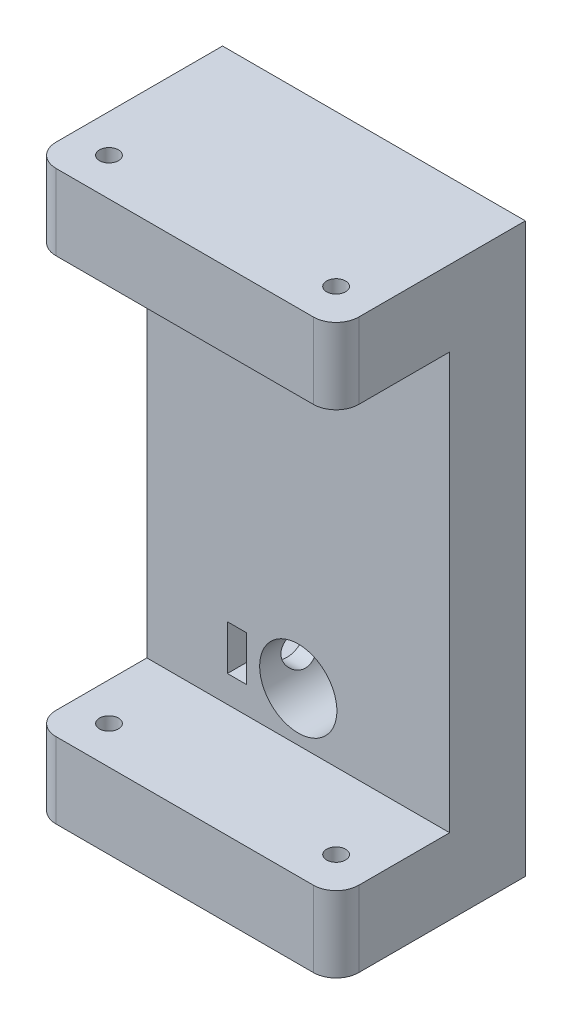
ISO-10303-21;
HEADER;
FILE_DESCRIPTION(('STEP AP214'),'2;1');
FILE_NAME('part.step','',(''),(''),'','','');
FILE_SCHEMA(('AUTOMOTIVE_DESIGN { 1 0 10303 214 1 1 1 1 }'));
ENDSEC;
DATA;
#1=APPLICATION_CONTEXT('core data for automotive mechanical design processes');
#2=APPLICATION_PROTOCOL_DEFINITION('international standard','automotive_design',2000,#1);
#3=PRODUCT_CONTEXT('',#1,'mechanical');
#4=PRODUCT('Part','Part','',(#3));
#5=PRODUCT_RELATED_PRODUCT_CATEGORY('part','',(#4));
#6=PRODUCT_DEFINITION_FORMATION('','',#4);
#7=PRODUCT_DEFINITION_CONTEXT('part definition',#1,'design');
#8=PRODUCT_DEFINITION('design','',#6,#7);
#9=PRODUCT_DEFINITION_SHAPE('','',#8);
#10=(LENGTH_UNIT() NAMED_UNIT(*) SI_UNIT(.MILLI.,.METRE.));
#11=(NAMED_UNIT(*) PLANE_ANGLE_UNIT() SI_UNIT($,.RADIAN.));
#12=(NAMED_UNIT(*) SI_UNIT($,.STERADIAN.) SOLID_ANGLE_UNIT());
#13=UNCERTAINTY_MEASURE_WITH_UNIT(LENGTH_MEASURE(1.E-05),#10,'distance_accuracy_value','');
#14=(GEOMETRIC_REPRESENTATION_CONTEXT(3) GLOBAL_UNCERTAINTY_ASSIGNED_CONTEXT((#13)) GLOBAL_UNIT_ASSIGNED_CONTEXT((#10,
#11,#12)) REPRESENTATION_CONTEXT('',''));
#15=CARTESIAN_POINT('',(0.,0.,0.));
#16=DIRECTION('',(0.,0.,1.));
#17=DIRECTION('',(1.,0.,0.));
#18=AXIS2_PLACEMENT_3D('',#15,#16,#17);
#19=CARTESIAN_POINT('',(-20.000012,-21.,4.63857049001604));
#20=DIRECTION('',(1.,0.,0.));
#21=DIRECTION('',(0.,0.,-1.));
#22=AXIS2_PLACEMENT_3D('',#19,#20,#21);
#23=CYLINDRICAL_SURFACE('',#22,2.55);
#24=CARTESIAN_POINT('',(-9.3585830921441,-21.,4.63857049001604));
#25=DIRECTION('',(-1.,0.,0.));
#26=DIRECTION('',(0.,-1.,0.));
#27=AXIS2_PLACEMENT_3D('',#24,#25,#26);
#28=CIRCLE('',#27,2.55);
#29=CARTESIAN_POINT('',(-9.3585830921441,-21.,2.08857049001604));
#30=VERTEX_POINT('',#29);
#31=EDGE_CURVE('E44',#30,#30,#28,.T.);
#32=CARTESIAN_POINT('',(-20.,-21.,4.63857049001604));
#33=DIRECTION('',(1.,0.,0.));
#34=DIRECTION('',(0.,0.,-1.));
#35=AXIS2_PLACEMENT_3D('',#32,#33,#34);
#36=CIRCLE('',#35,2.55);
#37=CARTESIAN_POINT('',(-20.,-21.,2.08857049001604));
#38=VERTEX_POINT('',#37);
#39=EDGE_CURVE('E200',#38,#38,#36,.F.);
#40=CARTESIAN_POINT('',(-9.3585830921441,-21.,2.08857049001604));
#41=CARTESIAN_POINT('',(-9.46943118493427,-21.,2.08857049001604));
#42=CARTESIAN_POINT('',(-9.58027927772443,-21.,2.08857049001604));
#43=CARTESIAN_POINT('',(-9.80197546330476,-21.,2.08857049001604));
#44=CARTESIAN_POINT('',(-9.91282355609493,-21.,2.08857049001604));
#45=CARTESIAN_POINT('',(-10.1345197416753,-21.,2.08857049001604));
#46=CARTESIAN_POINT('',(-10.2453678344654,-21.,2.08857049001604));
#47=CARTESIAN_POINT('',(-10.4670640200458,-21.,2.08857049001604));
#48=CARTESIAN_POINT('',(-10.5779121128359,-21.,2.08857049001604));
#49=CARTESIAN_POINT('',(-10.7996082984163,-21.,2.08857049001604));
#50=CARTESIAN_POINT('',(-10.9104563912064,-21.,2.08857049001604));
#51=CARTESIAN_POINT('',(-11.1321525767868,-21.,2.08857049001604));
#52=CARTESIAN_POINT('',(-11.2430006695769,-21.,2.08857049001604));
#53=CARTESIAN_POINT('',(-11.4646968551572,-21.,2.08857049001604));
#54=CARTESIAN_POINT('',(-11.5755449479474,-21.,2.08857049001604));
#55=CARTESIAN_POINT('',(-11.7972411335277,-21.,2.08857049001604));
#56=CARTESIAN_POINT('',(-11.9080892263179,-21.,2.08857049001604));
#57=CARTESIAN_POINT('',(-12.1297854118982,-21.,2.08857049001604));
#58=CARTESIAN_POINT('',(-12.2406335046884,-21.,2.08857049001604));
#59=CARTESIAN_POINT('',(-12.4623296902687,-21.,2.08857049001604));
#60=CARTESIAN_POINT('',(-12.5731777830589,-21.,2.08857049001604));
#61=CARTESIAN_POINT('',(-12.7948739686392,-21.,2.08857049001604));
#62=CARTESIAN_POINT('',(-12.9057220614294,-21.,2.08857049001604));
#63=CARTESIAN_POINT('',(-13.1274182470097,-21.,2.08857049001604));
#64=CARTESIAN_POINT('',(-13.2382663397999,-21.,2.08857049001604));
#65=CARTESIAN_POINT('',(-13.4599625253802,-21.,2.08857049001604));
#66=CARTESIAN_POINT('',(-13.5708106181704,-21.,2.08857049001604));
#67=CARTESIAN_POINT('',(-13.7925068037507,-21.,2.08857049001604));
#68=CARTESIAN_POINT('',(-13.9033548965409,-21.,2.08857049001604));
#69=CARTESIAN_POINT('',(-14.1250510821212,-21.,2.08857049001604));
#70=CARTESIAN_POINT('',(-14.2358991749114,-21.,2.08857049001604));
#71=CARTESIAN_POINT('',(-14.4575953604917,-21.,2.08857049001604));
#72=CARTESIAN_POINT('',(-14.5684434532819,-21.,2.08857049001604));
#73=CARTESIAN_POINT('',(-14.7901396388622,-21.,2.08857049001604));
#74=CARTESIAN_POINT('',(-14.9009877316524,-21.,2.08857049001604));
#75=CARTESIAN_POINT('',(-15.1226839172327,-21.,2.08857049001604));
#76=CARTESIAN_POINT('',(-15.2335320100229,-21.,2.08857049001604));
#77=CARTESIAN_POINT('',(-15.4552281956032,-21.,2.08857049001604));
#78=CARTESIAN_POINT('',(-15.5660762883934,-21.,2.08857049001604));
#79=CARTESIAN_POINT('',(-15.7877724739737,-21.,2.08857049001604));
#80=CARTESIAN_POINT('',(-15.8986205667639,-21.,2.08857049001604));
#81=CARTESIAN_POINT('',(-16.1203167523442,-21.,2.08857049001604));
#82=CARTESIAN_POINT('',(-16.2311648451344,-21.,2.08857049001604));
#83=CARTESIAN_POINT('',(-16.4528610307147,-21.,2.08857049001604));
#84=CARTESIAN_POINT('',(-16.5637091235049,-21.,2.08857049001604));
#85=CARTESIAN_POINT('',(-16.7854053090852,-21.,2.08857049001604));
#86=CARTESIAN_POINT('',(-16.8962534018754,-21.,2.08857049001604));
#87=CARTESIAN_POINT('',(-17.1179495874557,-21.,2.08857049001604));
#88=CARTESIAN_POINT('',(-17.2287976802459,-21.,2.08857049001604));
#89=CARTESIAN_POINT('',(-17.4504938658262,-21.,2.08857049001604));
#90=CARTESIAN_POINT('',(-17.5613419586164,-21.,2.08857049001604));
#91=CARTESIAN_POINT('',(-17.7830381441967,-21.,2.08857049001604));
#92=CARTESIAN_POINT('',(-17.8938862369869,-21.,2.08857049001604));
#93=CARTESIAN_POINT('',(-18.1155824225672,-21.,2.08857049001604));
#94=CARTESIAN_POINT('',(-18.2264305153574,-21.,2.08857049001604));
#95=CARTESIAN_POINT('',(-18.4481267009377,-21.,2.08857049001604));
#96=CARTESIAN_POINT('',(-18.5589747937278,-21.,2.08857049001604));
#97=CARTESIAN_POINT('',(-18.7806709793082,-21.,2.08857049001604));
#98=CARTESIAN_POINT('',(-18.8915190720983,-21.,2.08857049001604));
#99=CARTESIAN_POINT('',(-19.1132152576787,-21.,2.08857049001604));
#100=CARTESIAN_POINT('',(-19.2240633504688,-21.,2.08857049001604));
#101=CARTESIAN_POINT('',(-19.4457595360492,-21.,2.08857049001604));
#102=CARTESIAN_POINT('',(-19.5566076288393,-21.,2.08857049001604));
#103=CARTESIAN_POINT('',(-19.7783038144197,-21.,2.08857049001604));
#104=CARTESIAN_POINT('',(-19.8891519072098,-21.,2.08857049001604));
#105=CARTESIAN_POINT('',(-20.,-21.,2.08857049001604));
#106=B_SPLINE_CURVE_WITH_KNOTS('',3,(#40,#41,#42,#43,#44,#45,#46,#47,#48,#49,#50,#51,#52,#53,
#54,#55,#56,#57,#58,#59,#60,#61,#62,#63,#64,#65,#66,#67,#68,#69,#70,#71,#72,#73,#74,#75,#76,#77,
#78,#79,#80,#81,#82,#83,#84,#85,#86,#87,#88,#89,#90,#91,#92,#93,#94,#95,#96,#97,#98,#99,#100,
#101,#102,#103,#104,#105),.UNSPECIFIED.,.F.,.F.,(4,2,2,2,2,2,2,2,2,2,2,2,2,2,2,2,2,2,2,2,2,2,2,
2,2,2,2,2,2,2,2,2,4),(0.,0.332544278370497,0.665088556740995,0.99763283511149,1.33017711348199,
1.66272139185249,1.99526567022298,2.32780994859348,2.66035422696398,2.99289850533447,
3.32544278370497,3.65798706207547,3.99053134044596,4.32307561881646,4.65561989718696,
4.98816417555745,5.32070845392795,5.65325273229845,5.98579701066894,6.31834128903944,
6.65088556740994,6.98342984578044,7.31597412415093,7.64851840252143,7.98106268089193,
8.31360695926243,8.64615123763292,8.97869551600342,9.31123979437391,9.64378407274441,
9.97632835111491,10.3088726294854,10.6414169078559),.UNSPECIFIED.);
#107=EDGE_CURVE('BSEAM40',#30,#38,#106,.T.);
#108=ORIENTED_EDGE('',*,*,#31,.F.);
#109=ORIENTED_EDGE('',*,*,#39,.T.);
#110=ORIENTED_EDGE('',*,*,#107,.T.);
#111=ORIENTED_EDGE('',*,*,#107,.F.);
#112=EDGE_LOOP('',(#108,#110,#109,#111));
#113=FACE_BOUND('',#112,.T.);
#114=ADVANCED_FACE('F40',(#113),#23,.F.);
#115=CARTESIAN_POINT('',(0.,-21.,10.));
#116=DIRECTION('',(0.,0.,-1.));
#117=DIRECTION('',(-1.,0.,0.));
#118=AXIS2_PLACEMENT_3D('',#115,#116,#117);
#119=CYLINDRICAL_SURFACE('',#118,5.1);
#120=CARTESIAN_POINT('',(0.,-21.,10.));
#121=DIRECTION('',(0.,0.,-1.));
#122=DIRECTION('',(-1.,0.,0.));
#123=AXIS2_PLACEMENT_3D('',#120,#121,#122);
#124=CIRCLE('',#123,5.1);
#125=CARTESIAN_POINT('',(-5.1,-21.,10.));
#126=VERTEX_POINT('',#125);
#127=EDGE_CURVE('E417',#126,#126,#124,.T.);
#128=ORIENTED_EDGE('',*,*,#127,.F.);
#129=EDGE_LOOP('',(#128));
#130=FACE_BOUND('',#129,.T.);
#131=CARTESIAN_POINT('',(0.,-21.,0.));
#132=DIRECTION('',(0.,0.,-1.));
#133=DIRECTION('',(-1.,0.,0.));
#134=AXIS2_PLACEMENT_3D('',#131,#132,#133);
#135=CIRCLE('',#134,5.1);
#136=CARTESIAN_POINT('',(-5.1,-21.,0.));
#137=VERTEX_POINT('',#136);
#138=EDGE_CURVE('E425',#137,#137,#135,.T.);
#139=ORIENTED_EDGE('',*,*,#138,.T.);
#140=EDGE_LOOP('',(#139));
#141=FACE_BOUND('',#140,.T.);
#142=CARTESIAN_POINT('',(-5.1,-21.,7.18857049001604));
#143=CARTESIAN_POINT('',(-5.09999161101481,-21.134055215981,7.18856062757891));
#144=CARTESIAN_POINT('',(-5.09465723117983,-21.268275947126,7.17793641700653));
#145=CARTESIAN_POINT('',(-5.0738412693224,-21.5327474837153,7.13590603243075));
#146=CARTESIAN_POINT('',(-5.05834041731424,-21.6629902575354,7.10446039147252));
#147=CARTESIAN_POINT('',(-5.01881504740926,-21.9152803039425,7.02232617484282));
#148=CARTESIAN_POINT('',(-4.99482367825404,-22.03735728427,6.97171238247765));
#149=CARTESIAN_POINT('',(-4.94051732192344,-22.2711052360766,6.8530654332392));
#150=CARTESIAN_POINT('',(-4.91020283337309,-22.3827770270785,6.78503364980804));
#151=CARTESIAN_POINT('',(-4.84388457951644,-22.6001449168362,6.62880149574056));
#152=CARTESIAN_POINT('',(-4.80764757612272,-22.705070783402,6.53962996578166));
#153=CARTESIAN_POINT('',(-4.73432924292265,-22.899187589374,6.34574072011104));
#154=CARTESIAN_POINT('',(-4.69724729378235,-22.9883665382979,6.24101126859912));
#155=CARTESIAN_POINT('',(-4.62312325504534,-23.1553925996659,6.00923794808185));
#156=CARTESIAN_POINT('',(-4.58630726760818,-23.2318246052605,5.88109343906033));
#157=CARTESIAN_POINT('',(-4.52079245882426,-23.3617289789672,5.61173378342469));
#158=CARTESIAN_POINT('',(-4.49208784401208,-23.4152177482672,5.47052806181817));
#159=CARTESIAN_POINT('',(-4.4486756094323,-23.4942377274841,5.1876744711477));
#160=CARTESIAN_POINT('',(-4.43323292537621,-23.5212509355293,5.04655913723286));
#161=CARTESIAN_POINT('',(-4.41613819369593,-23.5510888329634,4.76102445368968));
#162=CARTESIAN_POINT('',(-4.41447251825598,-23.5539374253578,4.61660851079744));
#163=CARTESIAN_POINT('',(-4.42452872155795,-23.5364525822836,4.34714112800934));
#164=CARTESIAN_POINT('',(-4.43467347338084,-23.5188506268174,4.22183921039659));
#165=CARTESIAN_POINT('',(-4.46444383271369,-23.4656966150967,3.97627962111545));
#166=CARTESIAN_POINT('',(-4.48407246021043,-23.4301388409394,3.85602356948766));
#167=CARTESIAN_POINT('',(-4.53103064852476,-23.3414349399839,3.62053620197342));
#168=CARTESIAN_POINT('',(-4.55852893693192,-23.2878984211457,3.50548717311223));
#169=CARTESIAN_POINT('',(-4.61813680917583,-23.1650563035535,3.28545304391157));
#170=CARTESIAN_POINT('',(-4.65024846189487,-23.0957436217218,3.18047249423582));
#171=CARTESIAN_POINT('',(-4.72038552653377,-22.9330684400276,2.96954129552079));
#172=CARTESIAN_POINT('',(-4.75864451103702,-22.8377708688417,2.86515546239683));
#173=CARTESIAN_POINT('',(-4.83346439416039,-22.6308667257905,2.67319517260924));
#174=CARTESIAN_POINT('',(-4.87002447494943,-22.5192524042644,2.58562875032964));
#175=CARTESIAN_POINT('',(-4.93940067571557,-22.2763170898712,2.42597205439023));
#176=CARTESIAN_POINT('',(-4.97196409613115,-22.1443216585785,2.35478928527939));
#177=CARTESIAN_POINT('',(-5.02752596859171,-21.8681888494964,2.23622306595637));
#178=CARTESIAN_POINT('',(-5.05053201306071,-21.7240612194764,2.18882071822738));
#179=CARTESIAN_POINT('',(-5.08277051040651,-21.4405545537348,2.1230582105385));
#180=CARTESIAN_POINT('',(-5.09298592668305,-21.3017709028983,2.1026178388617));
#181=CARTESIAN_POINT('',(-5.10186184320749,-21.0223879798708,2.08483542562314));
#182=CARTESIAN_POINT('',(-5.10052781739494,-20.8817895993314,2.08748244163557));
#183=CARTESIAN_POINT('',(-5.08702540246137,-20.6143559214361,2.11459754548367));
#184=CARTESIAN_POINT('',(-5.07570476504392,-20.4872985094738,2.13735844847693));
#185=CARTESIAN_POINT('',(-5.0444653685328,-20.2390624246289,2.20137757334919));
#186=CARTESIAN_POINT('',(-5.02454566154377,-20.1178844014835,2.24263783447465));
#187=CARTESIAN_POINT('',(-4.97719841102975,-19.880834048458,2.343566579418));
#188=CARTESIAN_POINT('',(-4.94957248506231,-19.7652124876517,2.403727667804));
#189=CARTESIAN_POINT('',(-4.88947134515745,-19.5453235276503,2.54019470592335));
#190=CARTESIAN_POINT('',(-4.85699406719345,-19.4410609940079,2.61650753326632));
#191=CARTESIAN_POINT('',(-4.78655964381388,-19.235992392382,2.79175957457274));
#192=CARTESIAN_POINT('',(-4.74837756249678,-19.1365312018293,2.89218480441074));
#193=CARTESIAN_POINT('',(-4.67319098500019,-18.9552663813764,3.10837962562647));
#194=CARTESIAN_POINT('',(-4.63618731841855,-18.8734749664274,3.2241597430273));
#195=CARTESIAN_POINT('',(-4.56580540156185,-18.7261448180863,3.47486180821038));
#196=CARTESIAN_POINT('',(-4.53268950460879,-18.6615849859931,3.610439218613));
#197=CARTESIAN_POINT('',(-4.4771388434128,-18.5568887935831,3.89272116227624));
#198=CARTESIAN_POINT('',(-4.45469032459994,-18.516720963414,4.03941108233603));
#199=CARTESIAN_POINT('',(-4.42581827620738,-18.4656526979766,4.32469155852624));
#200=CARTESIAN_POINT('',(-4.41806327847578,-18.4523128628075,4.46270783681739));
#201=CARTESIAN_POINT('',(-4.4157165432443,-18.4482426527008,4.73916051074433));
#202=CARTESIAN_POINT('',(-4.42111910005613,-18.4575024775707,4.87759669828714));
#203=CARTESIAN_POINT('',(-4.44306548267956,-18.4960883919872,5.13705342074522));
#204=CARTESIAN_POINT('',(-4.45849891064895,-18.5234188421125,5.25847669537121));
#205=CARTESIAN_POINT('',(-4.49746091144354,-18.5949027928265,5.49488118805999));
#206=CARTESIAN_POINT('',(-4.52099208803664,-18.6390617049669,5.60986032021391));
#207=CARTESIAN_POINT('',(-4.57542752962081,-18.7462700229815,5.83866388579016));
#208=CARTESIAN_POINT('',(-4.60672094158419,-18.8103892661041,5.95189173878575));
#209=CARTESIAN_POINT('',(-4.67250093619004,-18.9545143544425,6.16672045812088));
#210=CARTESIAN_POINT('',(-4.70698917510182,-19.0345284647879,6.26831523189734));
#211=CARTESIAN_POINT('',(-4.78028932653551,-19.2195843191501,6.46983296104067));
#212=CARTESIAN_POINT('',(-4.8191174134528,-19.3264857708141,6.56805284147084));
#213=CARTESIAN_POINT('',(-4.89288234331216,-19.556294188709,6.74553945643264));
#214=CARTESIAN_POINT('',(-4.92781708343555,-19.6792097272514,6.82479597499404));
#215=CARTESIAN_POINT('',(-4.99030052446938,-19.9394161494389,6.96222940908982));
#216=CARTESIAN_POINT('',(-5.01779525666238,-20.0768025280021,7.02025332115618));
#217=CARTESIAN_POINT('',(-5.05081520141817,-20.2897447165575,7.08879802598428));
#218=CARTESIAN_POINT('',(-5.06044760363512,-20.361816178236,7.10855699597788));
#219=CARTESIAN_POINT('',(-5.07671469820603,-20.507723522204,7.14171775735405));
#220=CARTESIAN_POINT('',(-5.08335122159622,-20.5815582976458,7.15512343202591));
#221=CARTESIAN_POINT('',(-5.09222964781453,-20.7128509416859,7.17300271174636));
#222=CARTESIAN_POINT('',(-5.09513754235783,-20.7700833304535,7.17883452527799));
#223=CARTESIAN_POINT('',(-5.09902454676252,-20.8848669609746,7.18662058607106));
#224=CARTESIAN_POINT('',(-5.10000360338661,-20.942418211485,7.18857472630602));
#225=CARTESIAN_POINT('',(-5.1,-21.,7.18857049001604));
#226=B_SPLINE_CURVE_WITH_KNOTS('',3,(#142,#143,#144,#145,#146,#147,#148,#149,#150,#151,#152,
#153,#154,#155,#156,#157,#158,#159,#160,#161,#162,#163,#164,#165,#166,#167,#168,#169,#170,#171,
#172,#173,#174,#175,#176,#177,#178,#179,#180,#181,#182,#183,#184,#185,#186,#187,#188,#189,#190,
#191,#192,#193,#194,#195,#196,#197,#198,#199,#200,#201,#202,#203,#204,#205,#206,#207,#208,#209,
#210,#211,#212,#213,#214,#215,#216,#217,#218,#219,#220,#221,#222,#223,#224,#225),.UNSPECIFIED.,
.T.,.F.,(4,2,2,2,2,2,2,2,2,2,2,2,2,2,2,2,2,2,2,2,2,2,2,2,2,2,2,2,2,2,2,2,2,2,2,2,2,2,2,2,2,4),
(0.,0.401941856421745,0.804647781758455,1.20579849650536,1.606917589483,2.03230348473112,
2.45801190601779,2.91673402398419,3.37512767140616,3.80607930957586,4.23660461189002,
4.61564566643767,4.9948075001048,5.38280112429643,5.77096929213566,6.2083560040139,
6.6459511322665,7.10386706646823,7.56141853126313,7.98107390701931,8.40053039504264,
8.78747611590611,9.17446450158875,9.57251782871142,9.97074099408265,10.4080700714258,
10.8457005096871,11.3045243951176,11.7627550546026,12.1769973413213,12.5910600265429,
12.9656772213394,13.3404149840965,13.7403296478909,14.1404528091562,14.5891936903014,
15.0381757762153,15.4903323484135,15.7160936379921,15.941716758218,16.1143612317936,
16.2870104704109),.UNSPECIFIED.);
#227=CARTESIAN_POINT('',(-5.1,-21.,7.18857049001604));
#228=VERTEX_POINT('',#227);
#229=EDGE_CURVE('E192',#228,#228,#226,.T.);
#230=ORIENTED_EDGE('',*,*,#229,.F.);
#231=EDGE_LOOP('',(#230));
#232=FACE_BOUND('',#231,.T.);
#233=ADVANCED_FACE('F224',(#130,#141,#232),#119,.F.);
#234=CARTESIAN_POINT('',(0.,0.,10.));
#235=DIRECTION('',(0.,0.,-1.));
#236=DIRECTION('',(-1.,0.,0.));
#237=AXIS2_PLACEMENT_3D('',#234,#235,#236);
#238=PLANE('',#237);
#239=DIRECTION('',(-1.,0.,0.));
#240=VECTOR('',#239,1.);
#241=CARTESIAN_POINT('',(0.,-23.9625236446833,10.));
#242=LINE('',#241,#240);
#243=CARTESIAN_POINT('',(-6.8585830921441,-23.9625236446833,10.));
#244=VERTEX_POINT('',#243);
#245=CARTESIAN_POINT('',(-9.3585830921441,-23.9625236446833,10.));
#246=VERTEX_POINT('',#245);
#247=EDGE_CURVE('E189',#244,#246,#242,.T.);
#248=ORIENTED_EDGE('',*,*,#247,.T.);
#249=DIRECTION('',(0.,1.,0.));
#250=VECTOR('',#249,1.);
#251=CARTESIAN_POINT('',(-9.35858309214409,0.,10.));
#252=LINE('',#251,#250);
#253=CARTESIAN_POINT('',(-9.3585830921441,-18.0374763553167,10.));
#254=VERTEX_POINT('',#253);
#255=EDGE_CURVE('E184',#246,#254,#252,.T.);
#256=ORIENTED_EDGE('',*,*,#255,.T.);
#257=DIRECTION('',(1.,0.,0.));
#258=VECTOR('',#257,1.);
#259=CARTESIAN_POINT('',(0.,-18.0374763553167,10.));
#260=LINE('',#259,#258);
#261=CARTESIAN_POINT('',(-6.8585830921441,-18.0374763553167,10.));
#262=VERTEX_POINT('',#261);
#263=EDGE_CURVE('E187',#254,#262,#260,.T.);
#264=ORIENTED_EDGE('',*,*,#263,.T.);
#265=DIRECTION('',(0.,-1.,0.));
#266=VECTOR('',#265,1.);
#267=CARTESIAN_POINT('',(-6.8585830921441,0.,10.));
#268=LINE('',#267,#266);
#269=EDGE_CURVE('E160',#262,#244,#268,.T.);
#270=ORIENTED_EDGE('',*,*,#269,.T.);
#271=EDGE_LOOP('',(#248,#256,#264,#270));
#272=FACE_BOUND('',#271,.T.);
#273=ORIENTED_EDGE('',*,*,#127,.T.);
#274=EDGE_LOOP('',(#273));
#275=FACE_BOUND('',#274,.T.);
#276=DIRECTION('',(-1.,0.,0.));
#277=VECTOR('',#276,1.);
#278=CARTESIAN_POINT('',(-20.,-27.5,10.));
#279=LINE('',#278,#277);
#280=CARTESIAN_POINT('',(20.,-27.5,10.));
#281=VERTEX_POINT('',#280);
#282=CARTESIAN_POINT('',(-20.,-27.5,10.));
#283=VERTEX_POINT('',#282);
#284=EDGE_CURVE('E402',#281,#283,#279,.T.);
#285=ORIENTED_EDGE('',*,*,#284,.F.);
#286=DIRECTION('',(0.,1.,0.));
#287=VECTOR('',#286,1.);
#288=CARTESIAN_POINT('',(20.,-37.5,10.));
#289=LINE('',#288,#287);
#290=CARTESIAN_POINT('',(20.,27.5,10.));
#291=VERTEX_POINT('',#290);
#292=EDGE_CURVE('E370',#281,#291,#289,.T.);
#293=ORIENTED_EDGE('',*,*,#292,.T.);
#294=DIRECTION('',(1.,0.,0.));
#295=VECTOR('',#294,1.);
#296=CARTESIAN_POINT('',(-20.,27.5,10.));
#297=LINE('',#296,#295);
#298=CARTESIAN_POINT('',(-20.,27.5,10.));
#299=VERTEX_POINT('',#298);
#300=EDGE_CURVE('E389',#299,#291,#297,.T.);
#301=ORIENTED_EDGE('',*,*,#300,.F.);
#302=DIRECTION('',(0.,-1.,0.));
#303=VECTOR('',#302,1.);
#304=CARTESIAN_POINT('',(-20.,-37.5,10.));
#305=LINE('',#304,#303);
#306=EDGE_CURVE('E366',#299,#283,#305,.T.);
#307=ORIENTED_EDGE('',*,*,#306,.T.);
#308=EDGE_LOOP('',(#285,#293,#301,#307));
#309=FACE_BOUND('',#308,.T.);
#310=ADVANCED_FACE('F229',(#272,#275,#309),#238,.F.);
#311=CARTESIAN_POINT('',(20.,-37.5,10.));
#312=DIRECTION('',(-1.,0.,0.));
#313=DIRECTION('',(0.,0.,1.));
#314=AXIS2_PLACEMENT_3D('',#311,#312,#313);
#315=PLANE('',#314);
#316=DIRECTION('',(0.,0.,-1.));
#317=VECTOR('',#316,1.);
#318=CARTESIAN_POINT('',(20.,-27.5,25.));
#319=LINE('',#318,#317);
#320=CARTESIAN_POINT('',(20.,-27.5,22.));
#321=VERTEX_POINT('',#320);
#322=EDGE_CURVE('E393',#321,#281,#319,.T.);
#323=ORIENTED_EDGE('',*,*,#322,.F.);
#324=DIRECTION('',(0.,1.,0.));
#325=VECTOR('',#324,1.);
#326=CARTESIAN_POINT('',(20.,-37.5,22.));
#327=LINE('',#326,#325);
#328=CARTESIAN_POINT('',(20.,-37.5,22.));
#329=VERTEX_POINT('',#328);
#330=EDGE_CURVE('E307',#321,#329,#327,.F.);
#331=ORIENTED_EDGE('',*,*,#330,.T.);
#332=DIRECTION('',(0.,0.,-1.));
#333=VECTOR('',#332,1.);
#334=CARTESIAN_POINT('',(20.,-37.5,10.));
#335=LINE('',#334,#333);
#336=CARTESIAN_POINT('',(20.,-37.5,0.));
#337=VERTEX_POINT('',#336);
#338=EDGE_CURVE('E364',#329,#337,#335,.T.);
#339=ORIENTED_EDGE('',*,*,#338,.T.);
#340=DIRECTION('',(0.,1.,0.));
#341=VECTOR('',#340,1.);
#342=CARTESIAN_POINT('',(20.,-37.5,0.));
#343=LINE('',#342,#341);
#344=CARTESIAN_POINT('',(20.,37.5,0.));
#345=VERTEX_POINT('',#344);
#346=EDGE_CURVE('E377',#337,#345,#343,.T.);
#347=ORIENTED_EDGE('',*,*,#346,.T.);
#348=DIRECTION('',(0.,0.,-1.));
#349=VECTOR('',#348,1.);
#350=CARTESIAN_POINT('',(20.,37.5,10.));
#351=LINE('',#350,#349);
#352=CARTESIAN_POINT('',(20.,37.5,22.));
#353=VERTEX_POINT('',#352);
#354=EDGE_CURVE('E349',#353,#345,#351,.T.);
#355=ORIENTED_EDGE('',*,*,#354,.F.);
#356=DIRECTION('',(0.,1.,0.));
#357=VECTOR('',#356,1.);
#358=CARTESIAN_POINT('',(20.,27.5,22.));
#359=LINE('',#358,#357);
#360=CARTESIAN_POINT('',(20.,27.5,22.));
#361=VERTEX_POINT('',#360);
#362=EDGE_CURVE('E331',#353,#361,#359,.F.);
#363=ORIENTED_EDGE('',*,*,#362,.T.);
#364=DIRECTION('',(0.,0.,-1.));
#365=VECTOR('',#364,1.);
#366=CARTESIAN_POINT('',(20.,27.5,25.));
#367=LINE('',#366,#365);
#368=EDGE_CURVE('E386',#361,#291,#367,.T.);
#369=ORIENTED_EDGE('',*,*,#368,.T.);
#370=ORIENTED_EDGE('',*,*,#292,.F.);
#371=EDGE_LOOP('',(#323,#331,#339,#347,#355,#363,#369,#370));
#372=FACE_BOUND('',#371,.T.);
#373=ADVANCED_FACE('F272',(#372),#315,.F.);
#374=CARTESIAN_POINT('',(-20.,37.5,10.));
#375=DIRECTION('',(0.,-1.,0.));
#376=DIRECTION('',(0.,0.,-1.));
#377=AXIS2_PLACEMENT_3D('',#374,#375,#376);
#378=PLANE('',#377);
#379=CARTESIAN_POINT('',(-15.,37.5,20.));
#380=DIRECTION('',(0.,1.,0.));
#381=DIRECTION('',(0.,0.,1.));
#382=AXIS2_PLACEMENT_3D('',#379,#380,#381);
#383=CIRCLE('',#382,1.25);
#384=CARTESIAN_POINT('',(-15.,37.5,21.25));
#385=VERTEX_POINT('',#384);
#386=EDGE_CURVE('E420',#385,#385,#383,.T.);
#387=ORIENTED_EDGE('',*,*,#386,.F.);
#388=EDGE_LOOP('',(#387));
#389=FACE_BOUND('',#388,.T.);
#390=CARTESIAN_POINT('',(15.,37.5,20.));
#391=DIRECTION('',(0.,1.,0.));
#392=DIRECTION('',(0.,0.,-1.));
#393=AXIS2_PLACEMENT_3D('',#390,#391,#392);
#394=CIRCLE('',#393,1.25);
#395=CARTESIAN_POINT('',(15.,37.5,18.75));
#396=VERTEX_POINT('',#395);
#397=EDGE_CURVE('E413',#396,#396,#394,.T.);
#398=ORIENTED_EDGE('',*,*,#397,.F.);
#399=EDGE_LOOP('',(#398));
#400=FACE_BOUND('',#399,.T.);
#401=DIRECTION('',(0.,0.,-1.));
#402=VECTOR('',#401,1.);
#403=CARTESIAN_POINT('',(-20.,37.5,10.));
#404=LINE('',#403,#402);
#405=CARTESIAN_POINT('',(-20.,37.5,22.));
#406=VERTEX_POINT('',#405);
#407=CARTESIAN_POINT('',(-20.,37.5,0.));
#408=VERTEX_POINT('',#407);
#409=EDGE_CURVE('E360',#406,#408,#404,.T.);
#410=ORIENTED_EDGE('',*,*,#409,.F.);
#411=CARTESIAN_POINT('',(-17.,37.5,22.));
#412=DIRECTION('',(0.,-1.,0.));
#413=DIRECTION('',(0.,0.,-1.));
#414=AXIS2_PLACEMENT_3D('',#411,#412,#413);
#415=CIRCLE('',#414,3.);
#416=CARTESIAN_POINT('',(-17.,37.5,25.));
#417=VERTEX_POINT('',#416);
#418=EDGE_CURVE('E333',#406,#417,#415,.F.);
#419=ORIENTED_EDGE('',*,*,#418,.T.);
#420=DIRECTION('',(-1.,0.,0.));
#421=VECTOR('',#420,1.);
#422=CARTESIAN_POINT('',(-20.,37.5,25.));
#423=LINE('',#422,#421);
#424=CARTESIAN_POINT('',(17.,37.5,25.));
#425=VERTEX_POINT('',#424);
#426=EDGE_CURVE('E388',#425,#417,#423,.T.);
#427=ORIENTED_EDGE('',*,*,#426,.F.);
#428=CARTESIAN_POINT('',(17.,37.5,22.));
#429=DIRECTION('',(0.,-1.,0.));
#430=DIRECTION('',(0.,0.,-1.));
#431=AXIS2_PLACEMENT_3D('',#428,#429,#430);
#432=CIRCLE('',#431,3.);
#433=EDGE_CURVE('E335',#425,#353,#432,.F.);
#434=ORIENTED_EDGE('',*,*,#433,.T.);
#435=ORIENTED_EDGE('',*,*,#354,.T.);
#436=DIRECTION('',(-1.,0.,0.));
#437=VECTOR('',#436,1.);
#438=CARTESIAN_POINT('',(-20.,37.5,0.));
#439=LINE('',#438,#437);
#440=EDGE_CURVE('E374',#345,#408,#439,.T.);
#441=ORIENTED_EDGE('',*,*,#440,.T.);
#442=EDGE_LOOP('',(#410,#419,#427,#434,#435,#441));
#443=FACE_BOUND('',#442,.T.);
#444=ADVANCED_FACE('F283',(#389,#400,#443),#378,.F.);
#445=CARTESIAN_POINT('',(-20.,-37.5,10.));
#446=DIRECTION('',(1.,0.,0.));
#447=DIRECTION('',(0.,0.,-1.));
#448=AXIS2_PLACEMENT_3D('',#445,#446,#447);
#449=PLANE('',#448);
#450=ORIENTED_EDGE('',*,*,#39,.F.);
#451=EDGE_LOOP('',(#450));
#452=FACE_BOUND('',#451,.T.);
#453=DIRECTION('',(0.,0.,-1.));
#454=VECTOR('',#453,1.);
#455=CARTESIAN_POINT('',(-20.,-37.5,10.));
#456=LINE('',#455,#454);
#457=CARTESIAN_POINT('',(-20.,-37.5,22.));
#458=VERTEX_POINT('',#457);
#459=CARTESIAN_POINT('',(-20.,-37.5,0.));
#460=VERTEX_POINT('',#459);
#461=EDGE_CURVE('E362',#458,#460,#456,.T.);
#462=ORIENTED_EDGE('',*,*,#461,.F.);
#463=DIRECTION('',(0.,-1.,0.));
#464=VECTOR('',#463,1.);
#465=CARTESIAN_POINT('',(-20.,-37.5,22.));
#466=LINE('',#465,#464);
#467=CARTESIAN_POINT('',(-20.,-27.5,22.));
#468=VERTEX_POINT('',#467);
#469=EDGE_CURVE('E11',#458,#468,#466,.F.);
#470=ORIENTED_EDGE('',*,*,#469,.T.);
#471=DIRECTION('',(0.,0.,-1.));
#472=VECTOR('',#471,1.);
#473=CARTESIAN_POINT('',(-20.,-27.5,25.));
#474=LINE('',#473,#472);
#475=EDGE_CURVE('E399',#468,#283,#474,.T.);
#476=ORIENTED_EDGE('',*,*,#475,.T.);
#477=ORIENTED_EDGE('',*,*,#306,.F.);
#478=DIRECTION('',(0.,0.,-1.));
#479=VECTOR('',#478,1.);
#480=CARTESIAN_POINT('',(-20.,27.5,25.));
#481=LINE('',#480,#479);
#482=CARTESIAN_POINT('',(-20.,27.5,22.));
#483=VERTEX_POINT('',#482);
#484=EDGE_CURVE('E380',#483,#299,#481,.T.);
#485=ORIENTED_EDGE('',*,*,#484,.F.);
#486=DIRECTION('',(0.,-1.,0.));
#487=VECTOR('',#486,1.);
#488=CARTESIAN_POINT('',(-20.,37.5,22.));
#489=LINE('',#488,#487);
#490=EDGE_CURVE('E337',#483,#406,#489,.F.);
#491=ORIENTED_EDGE('',*,*,#490,.T.);
#492=ORIENTED_EDGE('',*,*,#409,.T.);
#493=DIRECTION('',(0.,-1.,0.));
#494=VECTOR('',#493,1.);
#495=CARTESIAN_POINT('',(-20.,-37.5,0.));
#496=LINE('',#495,#494);
#497=EDGE_CURVE('E371',#408,#460,#496,.T.);
#498=ORIENTED_EDGE('',*,*,#497,.T.);
#499=EDGE_LOOP('',(#462,#470,#476,#477,#485,#491,#492,#498));
#500=FACE_BOUND('',#499,.T.);
#501=ADVANCED_FACE('F279',(#452,#500),#449,.F.);
#502=CARTESIAN_POINT('',(-20.,-37.5,10.));
#503=DIRECTION('',(0.,1.,0.));
#504=DIRECTION('',(0.,0.,1.));
#505=AXIS2_PLACEMENT_3D('',#502,#503,#504);
#506=PLANE('',#505);
#507=ORIENTED_EDGE('',*,*,#338,.F.);
#508=CARTESIAN_POINT('',(17.,-37.5,22.));
#509=DIRECTION('',(0.,1.,0.));
#510=DIRECTION('',(0.,0.,1.));
#511=AXIS2_PLACEMENT_3D('',#508,#509,#510);
#512=CIRCLE('',#511,3.);
#513=CARTESIAN_POINT('',(17.,-37.5,25.));
#514=VERTEX_POINT('',#513);
#515=EDGE_CURVE('E49',#329,#514,#512,.F.);
#516=ORIENTED_EDGE('',*,*,#515,.T.);
#517=DIRECTION('',(1.,0.,0.));
#518=VECTOR('',#517,1.);
#519=CARTESIAN_POINT('',(-20.,-37.5,25.));
#520=LINE('',#519,#518);
#521=CARTESIAN_POINT('',(-17.,-37.5,25.));
#522=VERTEX_POINT('',#521);
#523=EDGE_CURVE('E405',#522,#514,#520,.T.);
#524=ORIENTED_EDGE('',*,*,#523,.F.);
#525=CARTESIAN_POINT('',(-17.,-37.5,22.));
#526=DIRECTION('',(0.,1.,0.));
#527=DIRECTION('',(0.,0.,1.));
#528=AXIS2_PLACEMENT_3D('',#525,#526,#527);
#529=CIRCLE('',#528,3.);
#530=EDGE_CURVE('E313',#522,#458,#529,.F.);
#531=ORIENTED_EDGE('',*,*,#530,.T.);
#532=ORIENTED_EDGE('',*,*,#461,.T.);
#533=DIRECTION('',(1.,0.,0.));
#534=VECTOR('',#533,1.);
#535=CARTESIAN_POINT('',(-20.,-37.5,0.));
#536=LINE('',#535,#534);
#537=EDGE_CURVE('E367',#460,#337,#536,.T.);
#538=ORIENTED_EDGE('',*,*,#537,.T.);
#539=EDGE_LOOP('',(#507,#516,#524,#531,#532,#538));
#540=FACE_BOUND('',#539,.T.);
#541=ADVANCED_FACE('F276',(#540),#506,.F.);
#542=CARTESIAN_POINT('',(0.,0.,0.));
#543=DIRECTION('',(0.,0.,-1.));
#544=DIRECTION('',(-1.,0.,0.));
#545=AXIS2_PLACEMENT_3D('',#542,#543,#544);
#546=PLANE('',#545);
#547=DIRECTION('',(0.,1.,0.));
#548=VECTOR('',#547,1.);
#549=CARTESIAN_POINT('',(-9.3585830921441,-18.0374763553167,0.));
#550=LINE('',#549,#548);
#551=CARTESIAN_POINT('',(-9.3585830921441,-23.9625236446833,0.));
#552=VERTEX_POINT('',#551);
#553=CARTESIAN_POINT('',(-9.3585830921441,-18.0374763553167,0.));
#554=VERTEX_POINT('',#553);
#555=EDGE_CURVE('E65',#552,#554,#550,.T.);
#556=ORIENTED_EDGE('',*,*,#555,.F.);
#557=DIRECTION('',(-1.,0.,0.));
#558=VECTOR('',#557,1.);
#559=CARTESIAN_POINT('',(-6.8585830921441,-23.9625236446833,0.));
#560=LINE('',#559,#558);
#561=CARTESIAN_POINT('',(-6.8585830921441,-23.9625236446833,0.));
#562=VERTEX_POINT('',#561);
#563=EDGE_CURVE('E173',#562,#552,#560,.T.);
#564=ORIENTED_EDGE('',*,*,#563,.F.);
#565=DIRECTION('',(0.,-1.,0.));
#566=VECTOR('',#565,1.);
#567=CARTESIAN_POINT('',(-6.8585830921441,-18.0374763553167,0.));
#568=LINE('',#567,#566);
#569=CARTESIAN_POINT('',(-6.8585830921441,-18.0374763553167,0.));
#570=VERTEX_POINT('',#569);
#571=EDGE_CURVE('E157',#570,#562,#568,.T.);
#572=ORIENTED_EDGE('',*,*,#571,.F.);
#573=DIRECTION('',(1.,0.,0.));
#574=VECTOR('',#573,1.);
#575=CARTESIAN_POINT('',(-6.8585830921441,-18.0374763553167,0.));
#576=LINE('',#575,#574);
#577=EDGE_CURVE('E166',#554,#570,#576,.T.);
#578=ORIENTED_EDGE('',*,*,#577,.F.);
#579=EDGE_LOOP('',(#556,#564,#572,#578));
#580=FACE_BOUND('',#579,.T.);
#581=ORIENTED_EDGE('',*,*,#138,.F.);
#582=EDGE_LOOP('',(#581));
#583=FACE_BOUND('',#582,.T.);
#584=ORIENTED_EDGE('',*,*,#346,.F.);
#585=ORIENTED_EDGE('',*,*,#537,.F.);
#586=ORIENTED_EDGE('',*,*,#497,.F.);
#587=ORIENTED_EDGE('',*,*,#440,.F.);
#588=EDGE_LOOP('',(#584,#585,#586,#587));
#589=FACE_BOUND('',#588,.T.);
#590=ADVANCED_FACE('F170',(#580,#583,#589),#546,.T.);
#591=CARTESIAN_POINT('',(-20.,27.5,25.));
#592=DIRECTION('',(0.,1.,0.));
#593=DIRECTION('',(-1.,0.,0.));
#594=AXIS2_PLACEMENT_3D('',#591,#592,#593);
#595=PLANE('',#594);
#596=CARTESIAN_POINT('',(-15.,27.5,20.));
#597=DIRECTION('',(0.,1.,0.));
#598=DIRECTION('',(-1.,0.,0.));
#599=AXIS2_PLACEMENT_3D('',#596,#597,#598);
#600=CIRCLE('',#599,1.25);
#601=CARTESIAN_POINT('',(-16.25,27.5,20.));
#602=VERTEX_POINT('',#601);
#603=EDGE_CURVE('E353',#602,#602,#600,.T.);
#604=ORIENTED_EDGE('',*,*,#603,.T.);
#605=EDGE_LOOP('',(#604));
#606=FACE_BOUND('',#605,.T.);
#607=CARTESIAN_POINT('',(15.,27.5,20.));
#608=DIRECTION('',(0.,1.,0.));
#609=DIRECTION('',(-1.,0.,0.));
#610=AXIS2_PLACEMENT_3D('',#607,#608,#609);
#611=CIRCLE('',#610,1.25);
#612=CARTESIAN_POINT('',(13.75,27.5,20.));
#613=VERTEX_POINT('',#612);
#614=EDGE_CURVE('E354',#613,#613,#611,.T.);
#615=ORIENTED_EDGE('',*,*,#614,.T.);
#616=EDGE_LOOP('',(#615));
#617=FACE_BOUND('',#616,.T.);
#618=DIRECTION('',(1.,0.,0.));
#619=VECTOR('',#618,1.);
#620=CARTESIAN_POINT('',(-20.,27.5,25.));
#621=LINE('',#620,#619);
#622=CARTESIAN_POINT('',(-17.,27.5,25.));
#623=VERTEX_POINT('',#622);
#624=CARTESIAN_POINT('',(17.,27.5,25.));
#625=VERTEX_POINT('',#624);
#626=EDGE_CURVE('E392',#623,#625,#621,.T.);
#627=ORIENTED_EDGE('',*,*,#626,.F.);
#628=CARTESIAN_POINT('',(-17.,27.5,22.));
#629=DIRECTION('',(0.,1.,0.));
#630=DIRECTION('',(-1.,0.,0.));
#631=AXIS2_PLACEMENT_3D('',#628,#629,#630);
#632=CIRCLE('',#631,3.);
#633=EDGE_CURVE('E339',#623,#483,#632,.F.);
#634=ORIENTED_EDGE('',*,*,#633,.T.);
#635=ORIENTED_EDGE('',*,*,#484,.T.);
#636=ORIENTED_EDGE('',*,*,#300,.T.);
#637=ORIENTED_EDGE('',*,*,#368,.F.);
#638=CARTESIAN_POINT('',(17.,27.5,22.));
#639=DIRECTION('',(0.,1.,0.));
#640=DIRECTION('',(-1.,0.,0.));
#641=AXIS2_PLACEMENT_3D('',#638,#639,#640);
#642=CIRCLE('',#641,3.);
#643=EDGE_CURVE('E341',#361,#625,#642,.F.);
#644=ORIENTED_EDGE('',*,*,#643,.T.);
#645=EDGE_LOOP('',(#627,#634,#635,#636,#637,#644));
#646=FACE_BOUND('',#645,.T.);
#647=ADVANCED_FACE('F265',(#606,#617,#646),#595,.F.);
#648=CARTESIAN_POINT('',(0.,0.,25.));
#649=DIRECTION('',(0.,0.,1.));
#650=DIRECTION('',(1.,0.,0.));
#651=AXIS2_PLACEMENT_3D('',#648,#649,#650);
#652=PLANE('',#651);
#653=ORIENTED_EDGE('',*,*,#426,.T.);
#654=DIRECTION('',(0.,-1.,0.));
#655=VECTOR('',#654,1.);
#656=CARTESIAN_POINT('',(-17.,27.5,25.));
#657=LINE('',#656,#655);
#658=EDGE_CURVE('E343',#417,#623,#657,.T.);
#659=ORIENTED_EDGE('',*,*,#658,.T.);
#660=ORIENTED_EDGE('',*,*,#626,.T.);
#661=DIRECTION('',(0.,1.,0.));
#662=VECTOR('',#661,1.);
#663=CARTESIAN_POINT('',(17.,37.5,25.));
#664=LINE('',#663,#662);
#665=EDGE_CURVE('E346',#625,#425,#664,.T.);
#666=ORIENTED_EDGE('',*,*,#665,.T.);
#667=EDGE_LOOP('',(#653,#659,#660,#666));
#668=FACE_BOUND('',#667,.T.);
#669=ADVANCED_FACE('F261',(#668),#652,.T.);
#670=CARTESIAN_POINT('',(-20.,-27.5,25.));
#671=DIRECTION('',(0.,-1.,0.));
#672=DIRECTION('',(0.,0.,-1.));
#673=AXIS2_PLACEMENT_3D('',#670,#671,#672);
#674=PLANE('',#673);
#675=CARTESIAN_POINT('',(-15.,-27.5,20.));
#676=DIRECTION('',(0.,-1.,0.));
#677=DIRECTION('',(0.,0.,-1.));
#678=AXIS2_PLACEMENT_3D('',#675,#676,#677);
#679=CIRCLE('',#678,1.25);
#680=CARTESIAN_POINT('',(-15.,-27.5,18.75));
#681=VERTEX_POINT('',#680);
#682=EDGE_CURVE('E350',#681,#681,#679,.T.);
#683=ORIENTED_EDGE('',*,*,#682,.T.);
#684=EDGE_LOOP('',(#683));
#685=FACE_BOUND('',#684,.T.);
#686=CARTESIAN_POINT('',(15.,-27.5,20.));
#687=DIRECTION('',(0.,-1.,0.));
#688=DIRECTION('',(0.,0.,-1.));
#689=AXIS2_PLACEMENT_3D('',#686,#687,#688);
#690=CIRCLE('',#689,1.25);
#691=CARTESIAN_POINT('',(15.,-27.5,18.75));
#692=VERTEX_POINT('',#691);
#693=EDGE_CURVE('E355',#692,#692,#690,.T.);
#694=ORIENTED_EDGE('',*,*,#693,.T.);
#695=EDGE_LOOP('',(#694));
#696=FACE_BOUND('',#695,.T.);
#697=DIRECTION('',(-1.,0.,0.));
#698=VECTOR('',#697,1.);
#699=CARTESIAN_POINT('',(-20.,-27.5,25.));
#700=LINE('',#699,#698);
#701=CARTESIAN_POINT('',(17.,-27.5,25.));
#702=VERTEX_POINT('',#701);
#703=CARTESIAN_POINT('',(-17.,-27.5,25.));
#704=VERTEX_POINT('',#703);
#705=EDGE_CURVE('E401',#702,#704,#700,.T.);
#706=ORIENTED_EDGE('',*,*,#705,.F.);
#707=CARTESIAN_POINT('',(17.,-27.5,22.));
#708=DIRECTION('',(0.,-1.,0.));
#709=DIRECTION('',(0.,0.,-1.));
#710=AXIS2_PLACEMENT_3D('',#707,#708,#709);
#711=CIRCLE('',#710,3.);
#712=EDGE_CURVE('E323',#702,#321,#711,.F.);
#713=ORIENTED_EDGE('',*,*,#712,.T.);
#714=ORIENTED_EDGE('',*,*,#322,.T.);
#715=ORIENTED_EDGE('',*,*,#284,.T.);
#716=ORIENTED_EDGE('',*,*,#475,.F.);
#717=CARTESIAN_POINT('',(-17.,-27.5,22.));
#718=DIRECTION('',(0.,-1.,0.));
#719=DIRECTION('',(0.,0.,-1.));
#720=AXIS2_PLACEMENT_3D('',#717,#718,#719);
#721=CIRCLE('',#720,3.);
#722=EDGE_CURVE('E325',#468,#704,#721,.F.);
#723=ORIENTED_EDGE('',*,*,#722,.T.);
#724=EDGE_LOOP('',(#706,#713,#714,#715,#716,#723));
#725=FACE_BOUND('',#724,.T.);
#726=ADVANCED_FACE('F257',(#685,#696,#725),#674,.F.);
#727=CARTESIAN_POINT('',(0.,0.,25.));
#728=DIRECTION('',(0.,0.,-1.));
#729=DIRECTION('',(-1.,0.,0.));
#730=AXIS2_PLACEMENT_3D('',#727,#728,#729);
#731=PLANE('',#730);
#732=ORIENTED_EDGE('',*,*,#523,.T.);
#733=DIRECTION('',(0.,1.,0.));
#734=VECTOR('',#733,1.);
#735=CARTESIAN_POINT('',(17.,0.,25.));
#736=LINE('',#735,#734);
#737=EDGE_CURVE('E309',#514,#702,#736,.T.);
#738=ORIENTED_EDGE('',*,*,#737,.T.);
#739=ORIENTED_EDGE('',*,*,#705,.T.);
#740=DIRECTION('',(0.,-1.,0.));
#741=VECTOR('',#740,1.);
#742=CARTESIAN_POINT('',(-17.,0.,25.));
#743=LINE('',#742,#741);
#744=EDGE_CURVE('E328',#704,#522,#743,.T.);
#745=ORIENTED_EDGE('',*,*,#744,.T.);
#746=EDGE_LOOP('',(#732,#738,#739,#745));
#747=FACE_BOUND('',#746,.T.);
#748=ADVANCED_FACE('F250',(#747),#731,.F.);
#749=CARTESIAN_POINT('',(15.,-32.5,20.));
#750=DIRECTION('',(0.,-1.,0.));
#751=DIRECTION('',(0.,0.,-1.));
#752=AXIS2_PLACEMENT_3D('',#749,#750,#751);
#753=PLANE('',#752);
#754=CARTESIAN_POINT('',(15.,-32.5,20.));
#755=DIRECTION('',(0.,1.,0.));
#756=DIRECTION('',(0.,0.,-1.));
#757=AXIS2_PLACEMENT_3D('',#754,#755,#756);
#758=CIRCLE('',#757,1.25);
#759=CARTESIAN_POINT('',(15.,-32.5,18.75));
#760=VERTEX_POINT('',#759);
#761=EDGE_CURVE('E416',#760,#760,#758,.T.);
#762=ORIENTED_EDGE('',*,*,#761,.T.);
#763=EDGE_LOOP('',(#762));
#764=FACE_BOUND('',#763,.T.);
#765=ADVANCED_FACE('F247',(#764),#753,.F.);
#766=CARTESIAN_POINT('',(15.,-32.5,20.));
#767=DIRECTION('',(0.,1.,0.));
#768=DIRECTION('',(0.,0.,1.));
#769=AXIS2_PLACEMENT_3D('',#766,#767,#768);
#770=CYLINDRICAL_SURFACE('',#769,1.25);
#771=ORIENTED_EDGE('',*,*,#761,.F.);
#772=EDGE_LOOP('',(#771));
#773=FACE_BOUND('',#772,.T.);
#774=ORIENTED_EDGE('',*,*,#693,.F.);
#775=EDGE_LOOP('',(#774));
#776=FACE_BOUND('',#775,.T.);
#777=ADVANCED_FACE('F239',(#773,#776),#770,.F.);
#778=CARTESIAN_POINT('',(-15.,-32.5,20.));
#779=DIRECTION('',(0.,1.,0.));
#780=DIRECTION('',(0.,0.,1.));
#781=AXIS2_PLACEMENT_3D('',#778,#779,#780);
#782=PLANE('',#781);
#783=CARTESIAN_POINT('',(-15.,-32.5,20.));
#784=DIRECTION('',(0.,1.,0.));
#785=DIRECTION('',(0.,0.,1.));
#786=AXIS2_PLACEMENT_3D('',#783,#784,#785);
#787=CIRCLE('',#786,1.25);
#788=CARTESIAN_POINT('',(-15.,-32.5,21.25));
#789=VERTEX_POINT('',#788);
#790=EDGE_CURVE('E358',#789,#789,#787,.T.);
#791=ORIENTED_EDGE('',*,*,#790,.T.);
#792=EDGE_LOOP('',(#791));
#793=FACE_BOUND('',#792,.T.);
#794=ADVANCED_FACE('F235',(#793),#782,.T.);
#795=CARTESIAN_POINT('',(-15.,-32.5,20.));
#796=DIRECTION('',(0.,1.,0.));
#797=DIRECTION('',(0.,0.,1.));
#798=AXIS2_PLACEMENT_3D('',#795,#796,#797);
#799=CYLINDRICAL_SURFACE('',#798,1.25);
#800=ORIENTED_EDGE('',*,*,#790,.F.);
#801=EDGE_LOOP('',(#800));
#802=FACE_BOUND('',#801,.T.);
#803=ORIENTED_EDGE('',*,*,#682,.F.);
#804=EDGE_LOOP('',(#803));
#805=FACE_BOUND('',#804,.T.);
#806=ADVANCED_FACE('F238',(#802,#805),#799,.F.);
#807=ORIENTED_EDGE('',*,*,#397,.T.);
#808=EDGE_LOOP('',(#807));
#809=FACE_BOUND('',#808,.T.);
#810=ORIENTED_EDGE('',*,*,#614,.F.);
#811=EDGE_LOOP('',(#810));
#812=FACE_BOUND('',#811,.T.);
#813=ADVANCED_FACE('F245',(#809,#812),#770,.F.);
#814=ORIENTED_EDGE('',*,*,#386,.T.);
#815=EDGE_LOOP('',(#814));
#816=FACE_BOUND('',#815,.T.);
#817=ORIENTED_EDGE('',*,*,#603,.F.);
#818=EDGE_LOOP('',(#817));
#819=FACE_BOUND('',#818,.T.);
#820=ADVANCED_FACE('F241',(#816,#819),#799,.F.);
#821=CARTESIAN_POINT('',(-17.,0.,22.));
#822=DIRECTION('',(0.,1.,0.));
#823=DIRECTION('',(0.,0.,1.));
#824=AXIS2_PLACEMENT_3D('',#821,#822,#823);
#825=CYLINDRICAL_SURFACE('',#824,3.);
#826=ORIENTED_EDGE('',*,*,#418,.F.);
#827=ORIENTED_EDGE('',*,*,#490,.F.);
#828=ORIENTED_EDGE('',*,*,#633,.F.);
#829=ORIENTED_EDGE('',*,*,#658,.F.);
#830=EDGE_LOOP('',(#826,#827,#828,#829));
#831=FACE_BOUND('',#830,.T.);
#832=ADVANCED_FACE('F244',(#831),#825,.T.);
#833=CARTESIAN_POINT('',(17.,0.,22.));
#834=DIRECTION('',(0.,-1.,0.));
#835=DIRECTION('',(0.,0.,-1.));
#836=AXIS2_PLACEMENT_3D('',#833,#834,#835);
#837=CYLINDRICAL_SURFACE('',#836,3.);
#838=ORIENTED_EDGE('',*,*,#643,.F.);
#839=ORIENTED_EDGE('',*,*,#362,.F.);
#840=ORIENTED_EDGE('',*,*,#433,.F.);
#841=ORIENTED_EDGE('',*,*,#665,.F.);
#842=EDGE_LOOP('',(#838,#839,#840,#841));
#843=FACE_BOUND('',#842,.T.);
#844=ADVANCED_FACE('F293',(#843),#837,.T.);
#845=CARTESIAN_POINT('',(17.,0.,22.));
#846=DIRECTION('',(0.,1.,0.));
#847=DIRECTION('',(0.,0.,1.));
#848=AXIS2_PLACEMENT_3D('',#845,#846,#847);
#849=CYLINDRICAL_SURFACE('',#848,3.);
#850=ORIENTED_EDGE('',*,*,#515,.F.);
#851=ORIENTED_EDGE('',*,*,#330,.F.);
#852=ORIENTED_EDGE('',*,*,#712,.F.);
#853=ORIENTED_EDGE('',*,*,#737,.F.);
#854=EDGE_LOOP('',(#850,#851,#852,#853));
#855=FACE_BOUND('',#854,.T.);
#856=ADVANCED_FACE('F296',(#855),#849,.T.);
#857=CARTESIAN_POINT('',(-17.,0.,22.));
#858=DIRECTION('',(0.,-1.,0.));
#859=DIRECTION('',(0.,0.,-1.));
#860=AXIS2_PLACEMENT_3D('',#857,#858,#859);
#861=CYLINDRICAL_SURFACE('',#860,3.);
#862=ORIENTED_EDGE('',*,*,#722,.F.);
#863=ORIENTED_EDGE('',*,*,#469,.F.);
#864=ORIENTED_EDGE('',*,*,#530,.F.);
#865=ORIENTED_EDGE('',*,*,#744,.F.);
#866=EDGE_LOOP('',(#862,#863,#864,#865));
#867=FACE_BOUND('',#866,.T.);
#868=ADVANCED_FACE('F42',(#867),#861,.T.);
#869=CARTESIAN_POINT('',(-6.8585830921441,-21.,4.63857049001604));
#870=DIRECTION('',(1.,0.,0.));
#871=DIRECTION('',(0.,1.,0.));
#872=AXIS2_PLACEMENT_3D('',#869,#870,#871);
#873=CIRCLE('',#872,2.55);
#874=CARTESIAN_POINT('',(-6.8585830921441,-18.45,4.63857049001604));
#875=VERTEX_POINT('',#874);
#876=EDGE_CURVE('E180',#875,#875,#873,.T.);
#877=ORIENTED_EDGE('',*,*,#876,.F.);
#878=EDGE_LOOP('',(#877));
#879=FACE_BOUND('',#878,.T.);
#880=ORIENTED_EDGE('',*,*,#229,.T.);
#881=EDGE_LOOP('',(#880));
#882=FACE_BOUND('',#881,.T.);
#883=ADVANCED_FACE('F217',(#879,#882),#23,.F.);
#884=CARTESIAN_POINT('',(-6.8585830921441,-23.9625236446833,25.));
#885=DIRECTION('',(0.,-1.,0.));
#886=DIRECTION('',(0.,0.,-1.));
#887=AXIS2_PLACEMENT_3D('',#884,#885,#886);
#888=PLANE('',#887);
#889=DIRECTION('',(0.,0.,-1.));
#890=VECTOR('',#889,1.);
#891=CARTESIAN_POINT('',(-6.8585830921441,-23.9625236446833,25.));
#892=LINE('',#891,#890);
#893=EDGE_CURVE('E162',#244,#562,#892,.T.);
#894=ORIENTED_EDGE('',*,*,#893,.T.);
#895=ORIENTED_EDGE('',*,*,#563,.T.);
#896=DIRECTION('',(0.,0.,-1.));
#897=VECTOR('',#896,1.);
#898=CARTESIAN_POINT('',(-9.3585830921441,-23.9625236446833,25.));
#899=LINE('',#898,#897);
#900=EDGE_CURVE('E178',#246,#552,#899,.T.);
#901=ORIENTED_EDGE('',*,*,#900,.F.);
#902=ORIENTED_EDGE('',*,*,#247,.F.);
#903=EDGE_LOOP('',(#894,#895,#901,#902));
#904=FACE_BOUND('',#903,.T.);
#905=ADVANCED_FACE('F212',(#904),#888,.F.);
#906=CARTESIAN_POINT('',(-6.8585830921441,-18.0374763553167,25.));
#907=DIRECTION('',(0.,1.,0.));
#908=DIRECTION('',(0.,0.,1.));
#909=AXIS2_PLACEMENT_3D('',#906,#907,#908);
#910=PLANE('',#909);
#911=DIRECTION('',(0.,0.,-1.));
#912=VECTOR('',#911,1.);
#913=CARTESIAN_POINT('',(-9.3585830921441,-18.0374763553167,25.));
#914=LINE('',#913,#912);
#915=EDGE_CURVE('E163',#254,#554,#914,.T.);
#916=ORIENTED_EDGE('',*,*,#915,.T.);
#917=ORIENTED_EDGE('',*,*,#577,.T.);
#918=DIRECTION('',(0.,0.,-1.));
#919=VECTOR('',#918,1.);
#920=CARTESIAN_POINT('',(-6.8585830921441,-18.0374763553167,25.));
#921=LINE('',#920,#919);
#922=EDGE_CURVE('E57',#262,#570,#921,.T.);
#923=ORIENTED_EDGE('',*,*,#922,.F.);
#924=ORIENTED_EDGE('',*,*,#263,.F.);
#925=EDGE_LOOP('',(#916,#917,#923,#924));
#926=FACE_BOUND('',#925,.T.);
#927=ADVANCED_FACE('F167',(#926),#910,.F.);
#928=CARTESIAN_POINT('',(-9.3585830921441,-18.0374763553167,25.));
#929=DIRECTION('',(-1.,0.,0.));
#930=DIRECTION('',(0.,-1.,0.));
#931=AXIS2_PLACEMENT_3D('',#928,#929,#930);
#932=PLANE('',#931);
#933=ORIENTED_EDGE('',*,*,#31,.T.);
#934=EDGE_LOOP('',(#933));
#935=FACE_BOUND('',#934,.T.);
#936=ORIENTED_EDGE('',*,*,#900,.T.);
#937=ORIENTED_EDGE('',*,*,#555,.T.);
#938=ORIENTED_EDGE('',*,*,#915,.F.);
#939=ORIENTED_EDGE('',*,*,#255,.F.);
#940=EDGE_LOOP('',(#936,#937,#938,#939));
#941=FACE_BOUND('',#940,.T.);
#942=ADVANCED_FACE('F206',(#935,#941),#932,.F.);
#943=CARTESIAN_POINT('',(-6.8585830921441,-18.0374763553167,25.));
#944=DIRECTION('',(1.,0.,0.));
#945=DIRECTION('',(0.,1.,0.));
#946=AXIS2_PLACEMENT_3D('',#943,#944,#945);
#947=PLANE('',#946);
#948=ORIENTED_EDGE('',*,*,#876,.T.);
#949=EDGE_LOOP('',(#948));
#950=FACE_BOUND('',#949,.T.);
#951=ORIENTED_EDGE('',*,*,#922,.T.);
#952=ORIENTED_EDGE('',*,*,#571,.T.);
#953=ORIENTED_EDGE('',*,*,#893,.F.);
#954=ORIENTED_EDGE('',*,*,#269,.F.);
#955=EDGE_LOOP('',(#951,#952,#953,#954));
#956=FACE_BOUND('',#955,.T.);
#957=ADVANCED_FACE('F154',(#950,#956),#947,.F.);
#958=CLOSED_SHELL('',(#114,#233,#310,#373,#444,#501,#541,#590,#647,#669,#726,#748,#765,#777,
#794,#806,#813,#820,#832,#844,#856,#868,#883,#905,#927,#942,#957));
#959=MANIFOLD_SOLID_BREP('B2',#958);
#960=ADVANCED_BREP_SHAPE_REPRESENTATION('',(#18,#959),#14);
#961=SHAPE_DEFINITION_REPRESENTATION(#9,#960);
ENDSEC;
END-ISO-10303-21;
